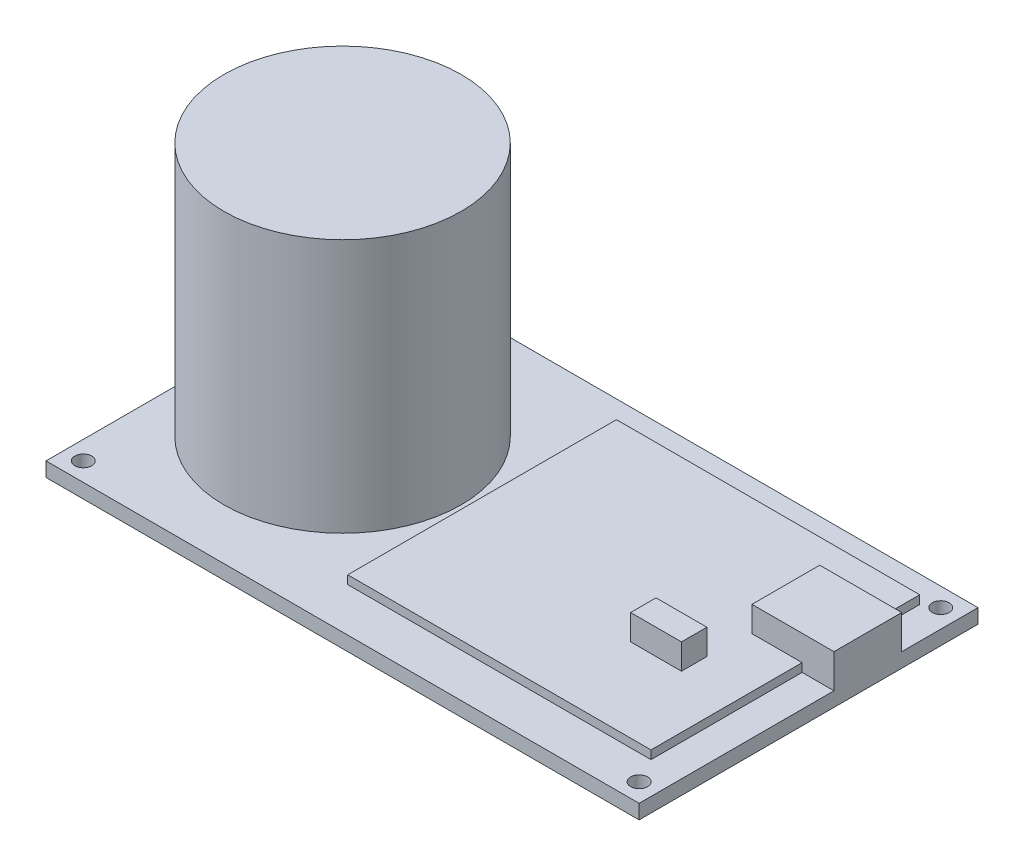
ISO-10303-21;
HEADER;
FILE_DESCRIPTION(('STEP AP214'),'2;1');
FILE_NAME('part.step','',(''),(''),'','','');
FILE_SCHEMA(('AUTOMOTIVE_DESIGN { 1 0 10303 214 1 1 1 1 }'));
ENDSEC;
DATA;
#1=APPLICATION_CONTEXT('core data for automotive mechanical design processes');
#2=APPLICATION_PROTOCOL_DEFINITION('international standard','automotive_design',2000,#1);
#3=PRODUCT_CONTEXT('',#1,'mechanical');
#4=PRODUCT('Part','Part','',(#3));
#5=PRODUCT_RELATED_PRODUCT_CATEGORY('part','',(#4));
#6=PRODUCT_DEFINITION_FORMATION('','',#4);
#7=PRODUCT_DEFINITION_CONTEXT('part definition',#1,'design');
#8=PRODUCT_DEFINITION('design','',#6,#7);
#9=PRODUCT_DEFINITION_SHAPE('','',#8);
#10=(LENGTH_UNIT() NAMED_UNIT(*) SI_UNIT(.MILLI.,.METRE.));
#11=(NAMED_UNIT(*) PLANE_ANGLE_UNIT() SI_UNIT($,.RADIAN.));
#12=(NAMED_UNIT(*) SI_UNIT($,.STERADIAN.) SOLID_ANGLE_UNIT());
#13=UNCERTAINTY_MEASURE_WITH_UNIT(LENGTH_MEASURE(1.E-05),#10,'distance_accuracy_value','');
#14=(GEOMETRIC_REPRESENTATION_CONTEXT(3) GLOBAL_UNCERTAINTY_ASSIGNED_CONTEXT((#13)) GLOBAL_UNIT_ASSIGNED_CONTEXT((#10,
#11,#12)) REPRESENTATION_CONTEXT('',''));
#15=CARTESIAN_POINT('',(0.,0.,0.));
#16=DIRECTION('',(0.,0.,1.));
#17=DIRECTION('',(1.,0.,0.));
#18=AXIS2_PLACEMENT_3D('',#15,#16,#17);
#19=CARTESIAN_POINT('',(0.,1.7,0.));
#20=DIRECTION('',(0.,-1.,0.));
#21=DIRECTION('',(0.,0.,-1.));
#22=AXIS2_PLACEMENT_3D('',#19,#20,#21);
#23=PLANE('',#22);
#24=CARTESIAN_POINT('',(67.8,1.7,-37.8));
#25=DIRECTION('',(0.,1.,0.));
#26=DIRECTION('',(0.,0.,1.));
#27=AXIS2_PLACEMENT_3D('',#24,#25,#26);
#28=CIRCLE('',#27,0.999999999999998);
#29=CARTESIAN_POINT('',(67.8,1.7,-36.8));
#30=VERTEX_POINT('',#29);
#31=EDGE_CURVE('E316',#30,#30,#28,.T.);
#32=ORIENTED_EDGE('',*,*,#31,.F.);
#33=EDGE_LOOP('',(#32));
#34=FACE_BOUND('',#33,.T.);
#35=CARTESIAN_POINT('',(67.8000000000004,1.7,-2.2));
#36=DIRECTION('',(0.,1.,0.));
#37=DIRECTION('',(0.,0.,1.));
#38=AXIS2_PLACEMENT_3D('',#35,#36,#37);
#39=CIRCLE('',#38,0.999999999999998);
#40=CARTESIAN_POINT('',(67.8000000000004,1.7,-1.2));
#41=VERTEX_POINT('',#40);
#42=EDGE_CURVE('E312',#41,#41,#39,.T.);
#43=ORIENTED_EDGE('',*,*,#42,.F.);
#44=EDGE_LOOP('',(#43));
#45=FACE_BOUND('',#44,.T.);
#46=CARTESIAN_POINT('',(2.2000000000004,1.7,-2.19999999999954));
#47=DIRECTION('',(0.,1.,0.));
#48=DIRECTION('',(0.,0.,1.));
#49=AXIS2_PLACEMENT_3D('',#46,#47,#48);
#50=CIRCLE('',#49,0.999999999999998);
#51=CARTESIAN_POINT('',(2.2000000000004,1.7,-1.19999999999954));
#52=VERTEX_POINT('',#51);
#53=EDGE_CURVE('E323',#52,#52,#50,.T.);
#54=ORIENTED_EDGE('',*,*,#53,.F.);
#55=EDGE_LOOP('',(#54));
#56=FACE_BOUND('',#55,.T.);
#57=CARTESIAN_POINT('',(2.20000000000002,1.7,-37.7999999999995));
#58=DIRECTION('',(0.,1.,0.));
#59=DIRECTION('',(0.,0.,1.));
#60=AXIS2_PLACEMENT_3D('',#57,#58,#59);
#61=CIRCLE('',#60,0.999999999999998);
#62=CARTESIAN_POINT('',(2.20000000000002,1.7,-36.7999999999995));
#63=VERTEX_POINT('',#62);
#64=EDGE_CURVE('E317',#63,#63,#61,.T.);
#65=ORIENTED_EDGE('',*,*,#64,.F.);
#66=EDGE_LOOP('',(#65));
#67=FACE_BOUND('',#66,.T.);
#68=CARTESIAN_POINT('',(15.,1.7,-20.));
#69=DIRECTION('',(0.,-1.,0.));
#70=DIRECTION('',(0.,0.,-1.));
#71=AXIS2_PLACEMENT_3D('',#68,#69,#70);
#72=CIRCLE('',#71,14.);
#73=CARTESIAN_POINT('',(15.,1.7,-34.));
#74=VERTEX_POINT('',#73);
#75=EDGE_CURVE('E368',#74,#74,#72,.F.);
#76=ORIENTED_EDGE('',*,*,#75,.F.);
#77=EDGE_LOOP('',(#76));
#78=FACE_BOUND('',#77,.T.);
#79=DIRECTION('',(0.,0.,-1.));
#80=VECTOR('',#79,1.);
#81=CARTESIAN_POINT('',(66.2439566800401,1.7,-5.16164214262371));
#82=LINE('',#81,#80);
#83=CARTESIAN_POINT('',(66.2439566800401,1.7,-5.16164214262371));
#84=VERTEX_POINT('',#83);
#85=CARTESIAN_POINT('',(66.2439566800401,1.7,-23.));
#86=VERTEX_POINT('',#85);
#87=EDGE_CURVE('E51',#84,#86,#82,.T.);
#88=ORIENTED_EDGE('',*,*,#87,.F.);
#89=DIRECTION('',(1.,0.,0.));
#90=VECTOR('',#89,1.);
#91=CARTESIAN_POINT('',(30.4498755707243,1.7,-5.16164214262371));
#92=LINE('',#91,#90);
#93=CARTESIAN_POINT('',(30.4498755707243,1.7,-5.16164214262371));
#94=VERTEX_POINT('',#93);
#95=EDGE_CURVE('E55',#94,#84,#92,.T.);
#96=ORIENTED_EDGE('',*,*,#95,.F.);
#97=DIRECTION('',(0.,0.,1.));
#98=VECTOR('',#97,1.);
#99=CARTESIAN_POINT('',(30.4498755707243,1.7,-5.16164214262371));
#100=LINE('',#99,#98);
#101=CARTESIAN_POINT('',(30.4498755707243,1.7,-36.8793482456979));
#102=VERTEX_POINT('',#101);
#103=EDGE_CURVE('E207',#102,#94,#100,.T.);
#104=ORIENTED_EDGE('',*,*,#103,.F.);
#105=DIRECTION('',(-1.,0.,0.));
#106=VECTOR('',#105,1.);
#107=CARTESIAN_POINT('',(30.4498755707243,1.7,-36.8793482456979));
#108=LINE('',#107,#106);
#109=CARTESIAN_POINT('',(66.2439566800401,1.7,-36.8793482456979));
#110=VERTEX_POINT('',#109);
#111=EDGE_CURVE('E204',#110,#102,#108,.T.);
#112=ORIENTED_EDGE('',*,*,#111,.F.);
#113=CARTESIAN_POINT('',(66.2439566800401,1.7,-31.));
#114=VERTEX_POINT('',#113);
#115=EDGE_CURVE('E459',#114,#110,#82,.T.);
#116=ORIENTED_EDGE('',*,*,#115,.F.);
#117=DIRECTION('',(-1.,0.,0.));
#118=VECTOR('',#117,1.);
#119=CARTESIAN_POINT('',(60.3214945967352,1.7,-31.));
#120=LINE('',#119,#118);
#121=CARTESIAN_POINT('',(70.,1.7,-31.));
#122=VERTEX_POINT('',#121);
#123=EDGE_CURVE('E288',#122,#114,#120,.T.);
#124=ORIENTED_EDGE('',*,*,#123,.F.);
#125=DIRECTION('',(0.,0.,-1.));
#126=VECTOR('',#125,1.);
#127=CARTESIAN_POINT('',(70.,1.7,0.));
#128=LINE('',#127,#126);
#129=CARTESIAN_POINT('',(70.,1.7,-40.));
#130=VERTEX_POINT('',#129);
#131=EDGE_CURVE('E343',#122,#130,#128,.T.);
#132=ORIENTED_EDGE('',*,*,#131,.T.);
#133=DIRECTION('',(-1.,0.,0.));
#134=VECTOR('',#133,1.);
#135=CARTESIAN_POINT('',(0.,1.7,-40.));
#136=LINE('',#135,#134);
#137=CARTESIAN_POINT('',(0.,1.7,-40.));
#138=VERTEX_POINT('',#137);
#139=EDGE_CURVE('E347',#130,#138,#136,.T.);
#140=ORIENTED_EDGE('',*,*,#139,.T.);
#141=DIRECTION('',(0.,0.,1.));
#142=VECTOR('',#141,1.);
#143=CARTESIAN_POINT('',(0.,1.7,0.));
#144=LINE('',#143,#142);
#145=CARTESIAN_POINT('',(0.,1.7,0.));
#146=VERTEX_POINT('',#145);
#147=EDGE_CURVE('E337',#138,#146,#144,.T.);
#148=ORIENTED_EDGE('',*,*,#147,.T.);
#149=DIRECTION('',(1.,0.,0.));
#150=VECTOR('',#149,1.);
#151=CARTESIAN_POINT('',(0.,1.7,0.));
#152=LINE('',#151,#150);
#153=CARTESIAN_POINT('',(70.,1.7,0.));
#154=VERTEX_POINT('',#153);
#155=EDGE_CURVE('E340',#146,#154,#152,.T.);
#156=ORIENTED_EDGE('',*,*,#155,.T.);
#157=CARTESIAN_POINT('',(70.,1.7,-23.));
#158=VERTEX_POINT('',#157);
#159=EDGE_CURVE('E344',#154,#158,#128,.T.);
#160=ORIENTED_EDGE('',*,*,#159,.T.);
#161=DIRECTION('',(1.,0.,0.));
#162=VECTOR('',#161,1.);
#163=CARTESIAN_POINT('',(60.3214945967352,1.7,-23.));
#164=LINE('',#163,#162);
#165=EDGE_CURVE('E283',#86,#158,#164,.T.);
#166=ORIENTED_EDGE('',*,*,#165,.F.);
#167=EDGE_LOOP('',(#88,#96,#104,#112,#116,#124,#132,#140,#148,#156,#160,#166));
#168=FACE_BOUND('',#167,.T.);
#169=ADVANCED_FACE('F36',(#34,#45,#56,#67,#78,#168),#23,.F.);
#170=CARTESIAN_POINT('',(60.3214945967352,5.7,-31.));
#171=DIRECTION('',(1.,0.,0.));
#172=DIRECTION('',(0.,0.,-1.));
#173=AXIS2_PLACEMENT_3D('',#170,#171,#172);
#174=PLANE('',#173);
#175=DIRECTION('',(0.,0.,-1.));
#176=VECTOR('',#175,1.);
#177=CARTESIAN_POINT('',(60.3214945967352,2.7,-31.));
#178=LINE('',#177,#176);
#179=CARTESIAN_POINT('',(60.3214945967352,2.7,-23.));
#180=VERTEX_POINT('',#179);
#181=CARTESIAN_POINT('',(60.3214945967352,2.7,-31.));
#182=VERTEX_POINT('',#181);
#183=EDGE_CURVE('E225',#180,#182,#178,.T.);
#184=ORIENTED_EDGE('',*,*,#183,.F.);
#185=DIRECTION('',(0.,-1.,0.));
#186=VECTOR('',#185,1.);
#187=CARTESIAN_POINT('',(60.3214945967352,5.7,-23.));
#188=LINE('',#187,#186);
#189=CARTESIAN_POINT('',(60.3214945967352,5.7,-23.));
#190=VERTEX_POINT('',#189);
#191=EDGE_CURVE('E306',#190,#180,#188,.T.);
#192=ORIENTED_EDGE('',*,*,#191,.F.);
#193=DIRECTION('',(0.,0.,1.));
#194=VECTOR('',#193,1.);
#195=CARTESIAN_POINT('',(60.3214945967352,5.7,-31.));
#196=LINE('',#195,#194);
#197=CARTESIAN_POINT('',(60.3214945967352,5.7,-31.));
#198=VERTEX_POINT('',#197);
#199=EDGE_CURVE('E284',#198,#190,#196,.T.);
#200=ORIENTED_EDGE('',*,*,#199,.F.);
#201=DIRECTION('',(0.,-1.,0.));
#202=VECTOR('',#201,1.);
#203=CARTESIAN_POINT('',(60.3214945967352,5.7,-31.));
#204=LINE('',#203,#202);
#205=EDGE_CURVE('E294',#198,#182,#204,.T.);
#206=ORIENTED_EDGE('',*,*,#205,.T.);
#207=EDGE_LOOP('',(#184,#192,#200,#206));
#208=FACE_BOUND('',#207,.T.);
#209=ADVANCED_FACE('F399',(#208),#174,.F.);
#210=CARTESIAN_POINT('',(60.3214945967352,5.7,-23.));
#211=DIRECTION('',(0.,0.,-1.));
#212=DIRECTION('',(-1.,0.,0.));
#213=AXIS2_PLACEMENT_3D('',#210,#211,#212);
#214=PLANE('',#213);
#215=DIRECTION('',(0.,1.,0.));
#216=VECTOR('',#215,1.);
#217=CARTESIAN_POINT('',(66.2439566800401,5.7,-23.));
#218=LINE('',#217,#216);
#219=CARTESIAN_POINT('',(66.2439566800401,2.7,-23.));
#220=VERTEX_POINT('',#219);
#221=EDGE_CURVE('E231',#86,#220,#218,.T.);
#222=ORIENTED_EDGE('',*,*,#221,.F.);
#223=ORIENTED_EDGE('',*,*,#165,.T.);
#224=DIRECTION('',(0.,-1.,0.));
#225=VECTOR('',#224,1.);
#226=CARTESIAN_POINT('',(70.,5.7,-23.));
#227=LINE('',#226,#225);
#228=CARTESIAN_POINT('',(70.,5.7,-23.));
#229=VERTEX_POINT('',#228);
#230=EDGE_CURVE('E303',#229,#158,#227,.T.);
#231=ORIENTED_EDGE('',*,*,#230,.F.);
#232=DIRECTION('',(1.,0.,0.));
#233=VECTOR('',#232,1.);
#234=CARTESIAN_POINT('',(60.3214945967352,5.7,-23.));
#235=LINE('',#234,#233);
#236=EDGE_CURVE('E287',#190,#229,#235,.T.);
#237=ORIENTED_EDGE('',*,*,#236,.F.);
#238=ORIENTED_EDGE('',*,*,#191,.T.);
#239=DIRECTION('',(-1.,0.,0.));
#240=VECTOR('',#239,1.);
#241=CARTESIAN_POINT('',(60.3214945967352,2.7,-23.));
#242=LINE('',#241,#240);
#243=EDGE_CURVE('E228',#220,#180,#242,.T.);
#244=ORIENTED_EDGE('',*,*,#243,.F.);
#245=EDGE_LOOP('',(#222,#223,#231,#237,#238,#244));
#246=FACE_BOUND('',#245,.T.);
#247=ADVANCED_FACE('F405',(#246),#214,.F.);
#248=CARTESIAN_POINT('',(60.3214945967352,5.7,-31.));
#249=DIRECTION('',(0.,0.,1.));
#250=DIRECTION('',(1.,0.,0.));
#251=AXIS2_PLACEMENT_3D('',#248,#249,#250);
#252=PLANE('',#251);
#253=DIRECTION('',(0.,-1.,0.));
#254=VECTOR('',#253,1.);
#255=CARTESIAN_POINT('',(66.2439566800401,5.7,-31.));
#256=LINE('',#255,#254);
#257=CARTESIAN_POINT('',(66.2439566800401,2.7,-31.));
#258=VERTEX_POINT('',#257);
#259=EDGE_CURVE('E11',#258,#114,#256,.T.);
#260=ORIENTED_EDGE('',*,*,#259,.F.);
#261=DIRECTION('',(1.,0.,0.));
#262=VECTOR('',#261,1.);
#263=CARTESIAN_POINT('',(60.3214945967352,2.7,-31.));
#264=LINE('',#263,#262);
#265=EDGE_CURVE('E222',#182,#258,#264,.T.);
#266=ORIENTED_EDGE('',*,*,#265,.F.);
#267=ORIENTED_EDGE('',*,*,#205,.F.);
#268=DIRECTION('',(-1.,0.,0.));
#269=VECTOR('',#268,1.);
#270=CARTESIAN_POINT('',(60.3214945967352,5.7,-31.));
#271=LINE('',#270,#269);
#272=CARTESIAN_POINT('',(70.,5.7,-31.));
#273=VERTEX_POINT('',#272);
#274=EDGE_CURVE('E292',#273,#198,#271,.T.);
#275=ORIENTED_EDGE('',*,*,#274,.F.);
#276=DIRECTION('',(0.,-1.,0.));
#277=VECTOR('',#276,1.);
#278=CARTESIAN_POINT('',(70.,5.7,-31.));
#279=LINE('',#278,#277);
#280=EDGE_CURVE('E300',#273,#122,#279,.T.);
#281=ORIENTED_EDGE('',*,*,#280,.T.);
#282=ORIENTED_EDGE('',*,*,#123,.T.);
#283=EDGE_LOOP('',(#260,#266,#267,#275,#281,#282));
#284=FACE_BOUND('',#283,.T.);
#285=ADVANCED_FACE('F417',(#284),#252,.F.);
#286=CARTESIAN_POINT('',(0.,0.,0.));
#287=DIRECTION('',(0.,-1.,0.));
#288=DIRECTION('',(0.,0.,-1.));
#289=AXIS2_PLACEMENT_3D('',#286,#287,#288);
#290=PLANE('',#289);
#291=CARTESIAN_POINT('',(2.20000000000002,0.,-37.7999999999995));
#292=DIRECTION('',(0.,1.,0.));
#293=DIRECTION('',(0.,0.,1.));
#294=AXIS2_PLACEMENT_3D('',#291,#292,#293);
#295=CIRCLE('',#294,0.999999999999998);
#296=CARTESIAN_POINT('',(2.20000000000002,0.,-36.7999999999995));
#297=VERTEX_POINT('',#296);
#298=EDGE_CURVE('E313',#297,#297,#295,.T.);
#299=ORIENTED_EDGE('',*,*,#298,.T.);
#300=EDGE_LOOP('',(#299));
#301=FACE_BOUND('',#300,.T.);
#302=CARTESIAN_POINT('',(2.2000000000004,0.,-2.19999999999954));
#303=DIRECTION('',(0.,1.,0.));
#304=DIRECTION('',(0.,0.,1.));
#305=AXIS2_PLACEMENT_3D('',#302,#303,#304);
#306=CIRCLE('',#305,0.999999999999998);
#307=CARTESIAN_POINT('',(2.2000000000004,0.,-1.19999999999954));
#308=VERTEX_POINT('',#307);
#309=EDGE_CURVE('E320',#308,#308,#306,.T.);
#310=ORIENTED_EDGE('',*,*,#309,.T.);
#311=EDGE_LOOP('',(#310));
#312=FACE_BOUND('',#311,.T.);
#313=CARTESIAN_POINT('',(67.8000000000004,0.,-2.2));
#314=DIRECTION('',(0.,1.,0.));
#315=DIRECTION('',(0.,0.,1.));
#316=AXIS2_PLACEMENT_3D('',#313,#314,#315);
#317=CIRCLE('',#316,0.999999999999998);
#318=CARTESIAN_POINT('',(67.8000000000004,0.,-1.2));
#319=VERTEX_POINT('',#318);
#320=EDGE_CURVE('E326',#319,#319,#317,.T.);
#321=ORIENTED_EDGE('',*,*,#320,.T.);
#322=EDGE_LOOP('',(#321));
#323=FACE_BOUND('',#322,.T.);
#324=CARTESIAN_POINT('',(67.8,0.,-37.8));
#325=DIRECTION('',(0.,1.,0.));
#326=DIRECTION('',(0.,0.,1.));
#327=AXIS2_PLACEMENT_3D('',#324,#325,#326);
#328=CIRCLE('',#327,0.999999999999998);
#329=CARTESIAN_POINT('',(67.8,0.,-36.8));
#330=VERTEX_POINT('',#329);
#331=EDGE_CURVE('E331',#330,#330,#328,.T.);
#332=ORIENTED_EDGE('',*,*,#331,.T.);
#333=EDGE_LOOP('',(#332));
#334=FACE_BOUND('',#333,.T.);
#335=DIRECTION('',(0.,0.,1.));
#336=VECTOR('',#335,1.);
#337=CARTESIAN_POINT('',(0.,0.,0.));
#338=LINE('',#337,#336);
#339=CARTESIAN_POINT('',(0.,0.,-40.));
#340=VERTEX_POINT('',#339);
#341=CARTESIAN_POINT('',(0.,0.,0.));
#342=VERTEX_POINT('',#341);
#343=EDGE_CURVE('E334',#340,#342,#338,.T.);
#344=ORIENTED_EDGE('',*,*,#343,.F.);
#345=DIRECTION('',(-1.,0.,0.));
#346=VECTOR('',#345,1.);
#347=CARTESIAN_POINT('',(0.,0.,-40.));
#348=LINE('',#347,#346);
#349=CARTESIAN_POINT('',(70.,0.,-40.));
#350=VERTEX_POINT('',#349);
#351=EDGE_CURVE('E341',#350,#340,#348,.T.);
#352=ORIENTED_EDGE('',*,*,#351,.F.);
#353=DIRECTION('',(0.,0.,-1.));
#354=VECTOR('',#353,1.);
#355=CARTESIAN_POINT('',(70.,0.,0.));
#356=LINE('',#355,#354);
#357=CARTESIAN_POINT('',(70.,0.,0.));
#358=VERTEX_POINT('',#357);
#359=EDGE_CURVE('E354',#358,#350,#356,.T.);
#360=ORIENTED_EDGE('',*,*,#359,.F.);
#361=DIRECTION('',(1.,0.,0.));
#362=VECTOR('',#361,1.);
#363=CARTESIAN_POINT('',(0.,0.,0.));
#364=LINE('',#363,#362);
#365=EDGE_CURVE('E352',#342,#358,#364,.T.);
#366=ORIENTED_EDGE('',*,*,#365,.F.);
#367=EDGE_LOOP('',(#344,#352,#360,#366));
#368=FACE_BOUND('',#367,.T.);
#369=DIRECTION('',(-1.,0.,0.));
#370=VECTOR('',#369,1.);
#371=CARTESIAN_POINT('',(66.,0.,-4.));
#372=LINE('',#371,#370);
#373=CARTESIAN_POINT('',(66.,0.,-4.));
#374=VERTEX_POINT('',#373);
#375=CARTESIAN_POINT('',(3.99999999999999,0.,-4.00000000000004));
#376=VERTEX_POINT('',#375);
#377=EDGE_CURVE('E248',#374,#376,#372,.T.);
#378=ORIENTED_EDGE('',*,*,#377,.F.);
#379=DIRECTION('',(0.,0.,1.));
#380=VECTOR('',#379,1.);
#381=CARTESIAN_POINT('',(66.,0.,-4.));
#382=LINE('',#381,#380);
#383=CARTESIAN_POINT('',(66.,0.,-36.));
#384=VERTEX_POINT('',#383);
#385=EDGE_CURVE('E234',#384,#374,#382,.T.);
#386=ORIENTED_EDGE('',*,*,#385,.F.);
#387=DIRECTION('',(1.,0.,0.));
#388=VECTOR('',#387,1.);
#389=CARTESIAN_POINT('',(66.,0.,-36.));
#390=LINE('',#389,#388);
#391=CARTESIAN_POINT('',(4.,0.,-36.));
#392=VERTEX_POINT('',#391);
#393=EDGE_CURVE('E239',#392,#384,#390,.T.);
#394=ORIENTED_EDGE('',*,*,#393,.F.);
#395=DIRECTION('',(0.,0.,-1.));
#396=VECTOR('',#395,1.);
#397=CARTESIAN_POINT('',(3.99999999999999,0.,-4.00000000000004));
#398=LINE('',#397,#396);
#399=EDGE_CURVE('E250',#376,#392,#398,.T.);
#400=ORIENTED_EDGE('',*,*,#399,.F.);
#401=EDGE_LOOP('',(#378,#386,#394,#400));
#402=FACE_BOUND('',#401,.T.);
#403=ADVANCED_FACE('F414',(#301,#312,#323,#334,#368,#402),#290,.T.);
#404=CARTESIAN_POINT('',(0.,1.7,0.));
#405=DIRECTION('',(1.,0.,0.));
#406=DIRECTION('',(0.,0.,-1.));
#407=AXIS2_PLACEMENT_3D('',#404,#405,#406);
#408=PLANE('',#407);
#409=ORIENTED_EDGE('',*,*,#343,.T.);
#410=DIRECTION('',(0.,-1.,0.));
#411=VECTOR('',#410,1.);
#412=CARTESIAN_POINT('',(0.,1.7,0.));
#413=LINE('',#412,#411);
#414=EDGE_CURVE('E365',#146,#342,#413,.T.);
#415=ORIENTED_EDGE('',*,*,#414,.F.);
#416=ORIENTED_EDGE('',*,*,#147,.F.);
#417=DIRECTION('',(0.,-1.,0.));
#418=VECTOR('',#417,1.);
#419=CARTESIAN_POINT('',(0.,1.7,-40.));
#420=LINE('',#419,#418);
#421=EDGE_CURVE('E349',#138,#340,#420,.T.);
#422=ORIENTED_EDGE('',*,*,#421,.T.);
#423=EDGE_LOOP('',(#409,#415,#416,#422));
#424=FACE_BOUND('',#423,.T.);
#425=ADVANCED_FACE('F38',(#424),#408,.F.);
#426=CARTESIAN_POINT('',(0.,1.7,0.));
#427=DIRECTION('',(0.,0.,-1.));
#428=DIRECTION('',(-1.,0.,0.));
#429=AXIS2_PLACEMENT_3D('',#426,#427,#428);
#430=PLANE('',#429);
#431=ORIENTED_EDGE('',*,*,#365,.T.);
#432=DIRECTION('',(0.,-1.,0.));
#433=VECTOR('',#432,1.);
#434=CARTESIAN_POINT('',(70.,1.7,0.));
#435=LINE('',#434,#433);
#436=EDGE_CURVE('E362',#154,#358,#435,.T.);
#437=ORIENTED_EDGE('',*,*,#436,.F.);
#438=ORIENTED_EDGE('',*,*,#155,.F.);
#439=ORIENTED_EDGE('',*,*,#414,.T.);
#440=EDGE_LOOP('',(#431,#437,#438,#439));
#441=FACE_BOUND('',#440,.T.);
#442=ADVANCED_FACE('F425',(#441),#430,.F.);
#443=CARTESIAN_POINT('',(70.,1.7,0.));
#444=DIRECTION('',(-1.,0.,0.));
#445=DIRECTION('',(0.,0.,1.));
#446=AXIS2_PLACEMENT_3D('',#443,#444,#445);
#447=PLANE('',#446);
#448=ORIENTED_EDGE('',*,*,#359,.T.);
#449=DIRECTION('',(0.,-1.,0.));
#450=VECTOR('',#449,1.);
#451=CARTESIAN_POINT('',(70.,1.7,-40.));
#452=LINE('',#451,#450);
#453=EDGE_CURVE('E359',#130,#350,#452,.T.);
#454=ORIENTED_EDGE('',*,*,#453,.F.);
#455=ORIENTED_EDGE('',*,*,#131,.F.);
#456=ORIENTED_EDGE('',*,*,#280,.F.);
#457=DIRECTION('',(0.,0.,-1.));
#458=VECTOR('',#457,1.);
#459=CARTESIAN_POINT('',(70.,5.7,-31.));
#460=LINE('',#459,#458);
#461=EDGE_CURVE('E290',#229,#273,#460,.T.);
#462=ORIENTED_EDGE('',*,*,#461,.F.);
#463=ORIENTED_EDGE('',*,*,#230,.T.);
#464=ORIENTED_EDGE('',*,*,#159,.F.);
#465=ORIENTED_EDGE('',*,*,#436,.T.);
#466=EDGE_LOOP('',(#448,#454,#455,#456,#462,#463,#464,#465));
#467=FACE_BOUND('',#466,.T.);
#468=ADVANCED_FACE('F422',(#467),#447,.F.);
#469=CARTESIAN_POINT('',(0.,1.7,-40.));
#470=DIRECTION('',(0.,0.,1.));
#471=DIRECTION('',(1.,0.,0.));
#472=AXIS2_PLACEMENT_3D('',#469,#470,#471);
#473=PLANE('',#472);
#474=ORIENTED_EDGE('',*,*,#351,.T.);
#475=ORIENTED_EDGE('',*,*,#421,.F.);
#476=ORIENTED_EDGE('',*,*,#139,.F.);
#477=ORIENTED_EDGE('',*,*,#453,.T.);
#478=EDGE_LOOP('',(#474,#475,#476,#477));
#479=FACE_BOUND('',#478,.T.);
#480=ADVANCED_FACE('F419',(#479),#473,.F.);
#481=CARTESIAN_POINT('',(67.8,0.,-37.8));
#482=DIRECTION('',(0.,1.,0.));
#483=DIRECTION('',(0.,0.,1.));
#484=AXIS2_PLACEMENT_3D('',#481,#482,#483);
#485=CYLINDRICAL_SURFACE('',#484,0.999999999999998);
#486=ORIENTED_EDGE('',*,*,#331,.F.);
#487=EDGE_LOOP('',(#486));
#488=FACE_BOUND('',#487,.T.);
#489=ORIENTED_EDGE('',*,*,#31,.T.);
#490=EDGE_LOOP('',(#489));
#491=FACE_BOUND('',#490,.T.);
#492=ADVANCED_FACE('F412',(#488,#491),#485,.F.);
#493=CARTESIAN_POINT('',(67.8000000000004,0.,-2.2));
#494=DIRECTION('',(0.,1.,0.));
#495=DIRECTION('',(0.,0.,1.));
#496=AXIS2_PLACEMENT_3D('',#493,#494,#495);
#497=CYLINDRICAL_SURFACE('',#496,0.999999999999998);
#498=ORIENTED_EDGE('',*,*,#320,.F.);
#499=EDGE_LOOP('',(#498));
#500=FACE_BOUND('',#499,.T.);
#501=ORIENTED_EDGE('',*,*,#42,.T.);
#502=EDGE_LOOP('',(#501));
#503=FACE_BOUND('',#502,.T.);
#504=ADVANCED_FACE('F651',(#500,#503),#497,.F.);
#505=CARTESIAN_POINT('',(2.2000000000004,0.,-2.19999999999954));
#506=DIRECTION('',(0.,1.,0.));
#507=DIRECTION('',(0.,0.,1.));
#508=AXIS2_PLACEMENT_3D('',#505,#506,#507);
#509=CYLINDRICAL_SURFACE('',#508,0.999999999999998);
#510=ORIENTED_EDGE('',*,*,#309,.F.);
#511=EDGE_LOOP('',(#510));
#512=FACE_BOUND('',#511,.T.);
#513=ORIENTED_EDGE('',*,*,#53,.T.);
#514=EDGE_LOOP('',(#513));
#515=FACE_BOUND('',#514,.T.);
#516=ADVANCED_FACE('F643',(#512,#515),#509,.F.);
#517=CARTESIAN_POINT('',(2.20000000000002,0.,-37.7999999999995));
#518=DIRECTION('',(0.,1.,0.));
#519=DIRECTION('',(0.,0.,1.));
#520=AXIS2_PLACEMENT_3D('',#517,#518,#519);
#521=CYLINDRICAL_SURFACE('',#520,0.999999999999998);
#522=ORIENTED_EDGE('',*,*,#298,.F.);
#523=EDGE_LOOP('',(#522));
#524=FACE_BOUND('',#523,.T.);
#525=ORIENTED_EDGE('',*,*,#64,.T.);
#526=EDGE_LOOP('',(#525));
#527=FACE_BOUND('',#526,.T.);
#528=ADVANCED_FACE('F635',(#524,#527),#521,.F.);
#529=CARTESIAN_POINT('',(15.,31.7,-20.));
#530=DIRECTION('',(0.,-1.,0.));
#531=DIRECTION('',(0.,0.,-1.));
#532=AXIS2_PLACEMENT_3D('',#529,#530,#531);
#533=CYLINDRICAL_SURFACE('',#532,14.);
#534=CARTESIAN_POINT('',(15.,31.7,-20.));
#535=DIRECTION('',(0.,1.,0.));
#536=DIRECTION('',(0.,0.,1.));
#537=AXIS2_PLACEMENT_3D('',#534,#535,#536);
#538=CIRCLE('',#537,14.);
#539=CARTESIAN_POINT('',(15.,31.7,-6.));
#540=VERTEX_POINT('',#539);
#541=EDGE_CURVE('E309',#540,#540,#538,.T.);
#542=ORIENTED_EDGE('',*,*,#541,.F.);
#543=EDGE_LOOP('',(#542));
#544=FACE_BOUND('',#543,.T.);
#545=ORIENTED_EDGE('',*,*,#75,.T.);
#546=EDGE_LOOP('',(#545));
#547=FACE_BOUND('',#546,.T.);
#548=ADVANCED_FACE('F627',(#544,#547),#533,.T.);
#549=CARTESIAN_POINT('',(0.,31.7,0.));
#550=DIRECTION('',(0.,1.,0.));
#551=DIRECTION('',(0.,0.,1.));
#552=AXIS2_PLACEMENT_3D('',#549,#550,#551);
#553=PLANE('',#552);
#554=ORIENTED_EDGE('',*,*,#541,.T.);
#555=EDGE_LOOP('',(#554));
#556=FACE_BOUND('',#555,.T.);
#557=ADVANCED_FACE('F619',(#556),#553,.T.);
#558=CARTESIAN_POINT('',(0.,5.7,0.));
#559=DIRECTION('',(0.,1.,0.));
#560=DIRECTION('',(0.,0.,1.));
#561=AXIS2_PLACEMENT_3D('',#558,#559,#560);
#562=PLANE('',#561);
#563=ORIENTED_EDGE('',*,*,#199,.T.);
#564=ORIENTED_EDGE('',*,*,#236,.T.);
#565=ORIENTED_EDGE('',*,*,#461,.T.);
#566=ORIENTED_EDGE('',*,*,#274,.T.);
#567=EDGE_LOOP('',(#563,#564,#565,#566));
#568=FACE_BOUND('',#567,.T.);
#569=ADVANCED_FACE('F453',(#568),#562,.T.);
#570=CARTESIAN_POINT('',(66.,-1.,-4.));
#571=DIRECTION('',(-1.,0.,0.));
#572=DIRECTION('',(0.,0.,1.));
#573=AXIS2_PLACEMENT_3D('',#570,#571,#572);
#574=PLANE('',#573);
#575=ORIENTED_EDGE('',*,*,#385,.T.);
#576=DIRECTION('',(0.,1.,0.));
#577=VECTOR('',#576,1.);
#578=CARTESIAN_POINT('',(66.,-1.,-4.));
#579=LINE('',#578,#577);
#580=CARTESIAN_POINT('',(66.,-1.,-4.));
#581=VERTEX_POINT('',#580);
#582=EDGE_CURVE('E261',#581,#374,#579,.T.);
#583=ORIENTED_EDGE('',*,*,#582,.F.);
#584=DIRECTION('',(0.,0.,1.));
#585=VECTOR('',#584,1.);
#586=CARTESIAN_POINT('',(66.,-1.,-4.));
#587=LINE('',#586,#585);
#588=CARTESIAN_POINT('',(66.,-1.,-36.));
#589=VERTEX_POINT('',#588);
#590=EDGE_CURVE('E235',#589,#581,#587,.T.);
#591=ORIENTED_EDGE('',*,*,#590,.F.);
#592=DIRECTION('',(0.,1.,0.));
#593=VECTOR('',#592,1.);
#594=CARTESIAN_POINT('',(66.,-1.,-36.));
#595=LINE('',#594,#593);
#596=EDGE_CURVE('E245',#589,#384,#595,.T.);
#597=ORIENTED_EDGE('',*,*,#596,.T.);
#598=EDGE_LOOP('',(#575,#583,#591,#597));
#599=FACE_BOUND('',#598,.T.);
#600=ADVANCED_FACE('F506',(#599),#574,.F.);
#601=CARTESIAN_POINT('',(66.,-1.,-4.));
#602=DIRECTION('',(0.,0.,-1.));
#603=DIRECTION('',(-1.,0.,0.));
#604=AXIS2_PLACEMENT_3D('',#601,#602,#603);
#605=PLANE('',#604);
#606=ORIENTED_EDGE('',*,*,#377,.T.);
#607=DIRECTION('',(0.,1.,0.));
#608=VECTOR('',#607,1.);
#609=CARTESIAN_POINT('',(3.99999999999999,-1.,-4.00000000000004));
#610=LINE('',#609,#608);
#611=CARTESIAN_POINT('',(3.99999999999999,-1.,-4.00000000000004));
#612=VERTEX_POINT('',#611);
#613=EDGE_CURVE('E258',#612,#376,#610,.T.);
#614=ORIENTED_EDGE('',*,*,#613,.F.);
#615=DIRECTION('',(-1.,0.,0.));
#616=VECTOR('',#615,1.);
#617=CARTESIAN_POINT('',(66.,-1.,-4.));
#618=LINE('',#617,#616);
#619=EDGE_CURVE('E238',#581,#612,#618,.T.);
#620=ORIENTED_EDGE('',*,*,#619,.F.);
#621=ORIENTED_EDGE('',*,*,#582,.T.);
#622=EDGE_LOOP('',(#606,#614,#620,#621));
#623=FACE_BOUND('',#622,.T.);
#624=ADVANCED_FACE('F502',(#623),#605,.F.);
#625=CARTESIAN_POINT('',(3.99999999999999,-1.,-4.00000000000004));
#626=DIRECTION('',(1.,0.,0.));
#627=DIRECTION('',(0.,0.,-1.));
#628=AXIS2_PLACEMENT_3D('',#625,#626,#627);
#629=PLANE('',#628);
#630=ORIENTED_EDGE('',*,*,#399,.T.);
#631=DIRECTION('',(0.,1.,0.));
#632=VECTOR('',#631,1.);
#633=CARTESIAN_POINT('',(4.,-1.,-36.));
#634=LINE('',#633,#632);
#635=CARTESIAN_POINT('',(4.,-1.,-36.));
#636=VERTEX_POINT('',#635);
#637=EDGE_CURVE('E256',#636,#392,#634,.T.);
#638=ORIENTED_EDGE('',*,*,#637,.F.);
#639=DIRECTION('',(0.,0.,-1.));
#640=VECTOR('',#639,1.);
#641=CARTESIAN_POINT('',(3.99999999999999,-1.,-4.00000000000004));
#642=LINE('',#641,#640);
#643=EDGE_CURVE('E241',#612,#636,#642,.T.);
#644=ORIENTED_EDGE('',*,*,#643,.F.);
#645=ORIENTED_EDGE('',*,*,#613,.T.);
#646=EDGE_LOOP('',(#630,#638,#644,#645));
#647=FACE_BOUND('',#646,.T.);
#648=ADVANCED_FACE('F498',(#647),#629,.F.);
#649=CARTESIAN_POINT('',(66.,-1.,-36.));
#650=DIRECTION('',(0.,0.,1.));
#651=DIRECTION('',(1.,0.,0.));
#652=AXIS2_PLACEMENT_3D('',#649,#650,#651);
#653=PLANE('',#652);
#654=ORIENTED_EDGE('',*,*,#393,.T.);
#655=ORIENTED_EDGE('',*,*,#596,.F.);
#656=DIRECTION('',(1.,0.,0.));
#657=VECTOR('',#656,1.);
#658=CARTESIAN_POINT('',(66.,-1.,-36.));
#659=LINE('',#658,#657);
#660=EDGE_CURVE('E243',#636,#589,#659,.T.);
#661=ORIENTED_EDGE('',*,*,#660,.F.);
#662=ORIENTED_EDGE('',*,*,#637,.T.);
#663=EDGE_LOOP('',(#654,#655,#661,#662));
#664=FACE_BOUND('',#663,.T.);
#665=ADVANCED_FACE('F494',(#664),#653,.F.);
#666=CARTESIAN_POINT('',(0.,-1.,0.));
#667=DIRECTION('',(0.,1.,0.));
#668=DIRECTION('',(0.,0.,1.));
#669=AXIS2_PLACEMENT_3D('',#666,#667,#668);
#670=PLANE('',#669);
#671=ORIENTED_EDGE('',*,*,#590,.T.);
#672=ORIENTED_EDGE('',*,*,#619,.T.);
#673=ORIENTED_EDGE('',*,*,#643,.T.);
#674=ORIENTED_EDGE('',*,*,#660,.T.);
#675=EDGE_LOOP('',(#671,#672,#673,#674));
#676=FACE_BOUND('',#675,.T.);
#677=ADVANCED_FACE('F485',(#676),#670,.F.);
#678=CARTESIAN_POINT('',(66.2439566800401,2.7,-5.16164214262371));
#679=DIRECTION('',(-1.,0.,0.));
#680=DIRECTION('',(0.,0.,1.));
#681=AXIS2_PLACEMENT_3D('',#678,#679,#680);
#682=PLANE('',#681);
#683=ORIENTED_EDGE('',*,*,#87,.T.);
#684=ORIENTED_EDGE('',*,*,#221,.T.);
#685=DIRECTION('',(0.,0.,-1.));
#686=VECTOR('',#685,1.);
#687=CARTESIAN_POINT('',(66.2439566800401,2.7,-5.16164214262371));
#688=LINE('',#687,#686);
#689=CARTESIAN_POINT('',(66.2439566800401,2.7,-5.16164214262371));
#690=VERTEX_POINT('',#689);
#691=EDGE_CURVE('E477',#690,#220,#688,.T.);
#692=ORIENTED_EDGE('',*,*,#691,.F.);
#693=DIRECTION('',(0.,-1.,0.));
#694=VECTOR('',#693,1.);
#695=CARTESIAN_POINT('',(66.2439566800401,2.7,-5.16164214262371));
#696=LINE('',#695,#694);
#697=EDGE_CURVE('E190',#690,#84,#696,.T.);
#698=ORIENTED_EDGE('',*,*,#697,.T.);
#699=EDGE_LOOP('',(#683,#684,#692,#698));
#700=FACE_BOUND('',#699,.T.);
#701=ADVANCED_FACE('F458',(#700),#682,.F.);
#702=CARTESIAN_POINT('',(66.2439566800401,2.7,-36.8793482456979));
#703=VERTEX_POINT('',#702);
#704=EDGE_CURVE('E194',#258,#703,#688,.T.);
#705=ORIENTED_EDGE('',*,*,#704,.F.);
#706=ORIENTED_EDGE('',*,*,#259,.T.);
#707=ORIENTED_EDGE('',*,*,#115,.T.);
#708=DIRECTION('',(0.,-1.,0.));
#709=VECTOR('',#708,1.);
#710=CARTESIAN_POINT('',(66.2439566800401,2.7,-36.8793482456979));
#711=LINE('',#710,#709);
#712=EDGE_CURVE('E213',#703,#110,#711,.T.);
#713=ORIENTED_EDGE('',*,*,#712,.F.);
#714=EDGE_LOOP('',(#705,#706,#707,#713));
#715=FACE_BOUND('',#714,.T.);
#716=ADVANCED_FACE('F474',(#715),#682,.F.);
#717=CARTESIAN_POINT('',(0.,2.7,0.));
#718=DIRECTION('',(0.,-1.,0.));
#719=DIRECTION('',(0.,0.,-1.));
#720=AXIS2_PLACEMENT_3D('',#717,#718,#719);
#721=PLANE('',#720);
#722=DIRECTION('',(-1.,0.,0.));
#723=VECTOR('',#722,1.);
#724=CARTESIAN_POINT('',(54.,2.7,-15.));
#725=LINE('',#724,#723);
#726=CARTESIAN_POINT('',(60.,2.7,-15.));
#727=VERTEX_POINT('',#726);
#728=CARTESIAN_POINT('',(54.,2.7,-15.));
#729=VERTEX_POINT('',#728);
#730=EDGE_CURVE('E211',#727,#729,#725,.T.);
#731=ORIENTED_EDGE('',*,*,#730,.T.);
#732=DIRECTION('',(0.,0.,-1.));
#733=VECTOR('',#732,1.);
#734=CARTESIAN_POINT('',(54.,2.7,-15.));
#735=LINE('',#734,#733);
#736=CARTESIAN_POINT('',(54.,2.7,-18.));
#737=VERTEX_POINT('',#736);
#738=EDGE_CURVE('E219',#729,#737,#735,.T.);
#739=ORIENTED_EDGE('',*,*,#738,.T.);
#740=DIRECTION('',(1.,0.,0.));
#741=VECTOR('',#740,1.);
#742=CARTESIAN_POINT('',(54.,2.7,-18.));
#743=LINE('',#742,#741);
#744=CARTESIAN_POINT('',(60.,2.7,-18.));
#745=VERTEX_POINT('',#744);
#746=EDGE_CURVE('E44',#737,#745,#743,.T.);
#747=ORIENTED_EDGE('',*,*,#746,.T.);
#748=DIRECTION('',(0.,0.,1.));
#749=VECTOR('',#748,1.);
#750=CARTESIAN_POINT('',(60.,2.7,-15.));
#751=LINE('',#750,#749);
#752=EDGE_CURVE('E208',#745,#727,#751,.T.);
#753=ORIENTED_EDGE('',*,*,#752,.T.);
#754=EDGE_LOOP('',(#731,#739,#747,#753));
#755=FACE_BOUND('',#754,.T.);
#756=ORIENTED_EDGE('',*,*,#691,.T.);
#757=ORIENTED_EDGE('',*,*,#243,.T.);
#758=ORIENTED_EDGE('',*,*,#183,.T.);
#759=ORIENTED_EDGE('',*,*,#265,.T.);
#760=ORIENTED_EDGE('',*,*,#704,.T.);
#761=DIRECTION('',(-1.,0.,0.));
#762=VECTOR('',#761,1.);
#763=CARTESIAN_POINT('',(30.4498755707243,2.7,-36.8793482456979));
#764=LINE('',#763,#762);
#765=CARTESIAN_POINT('',(30.4498755707243,2.7,-36.8793482456979));
#766=VERTEX_POINT('',#765);
#767=EDGE_CURVE('E200',#703,#766,#764,.T.);
#768=ORIENTED_EDGE('',*,*,#767,.T.);
#769=DIRECTION('',(0.,0.,1.));
#770=VECTOR('',#769,1.);
#771=CARTESIAN_POINT('',(30.4498755707243,2.7,-5.16164214262371));
#772=LINE('',#771,#770);
#773=CARTESIAN_POINT('',(30.4498755707243,2.7,-5.16164214262371));
#774=VERTEX_POINT('',#773);
#775=EDGE_CURVE('E195',#766,#774,#772,.T.);
#776=ORIENTED_EDGE('',*,*,#775,.T.);
#777=DIRECTION('',(1.,0.,0.));
#778=VECTOR('',#777,1.);
#779=CARTESIAN_POINT('',(30.4498755707243,2.7,-5.16164214262371));
#780=LINE('',#779,#778);
#781=EDGE_CURVE('E183',#774,#690,#780,.T.);
#782=ORIENTED_EDGE('',*,*,#781,.T.);
#783=EDGE_LOOP('',(#756,#757,#758,#759,#760,#768,#776,#782));
#784=FACE_BOUND('',#783,.T.);
#785=ADVANCED_FACE('F198',(#755,#784),#721,.F.);
#786=CARTESIAN_POINT('',(30.4498755707243,2.7,-5.16164214262371));
#787=DIRECTION('',(1.,0.,0.));
#788=DIRECTION('',(0.,0.,-1.));
#789=AXIS2_PLACEMENT_3D('',#786,#787,#788);
#790=PLANE('',#789);
#791=ORIENTED_EDGE('',*,*,#103,.T.);
#792=DIRECTION('',(0.,-1.,0.));
#793=VECTOR('',#792,1.);
#794=CARTESIAN_POINT('',(30.4498755707243,2.7,-5.16164214262371));
#795=LINE('',#794,#793);
#796=EDGE_CURVE('E187',#774,#94,#795,.T.);
#797=ORIENTED_EDGE('',*,*,#796,.F.);
#798=ORIENTED_EDGE('',*,*,#775,.F.);
#799=DIRECTION('',(0.,-1.,0.));
#800=VECTOR('',#799,1.);
#801=CARTESIAN_POINT('',(30.4498755707243,2.7,-36.8793482456979));
#802=LINE('',#801,#800);
#803=EDGE_CURVE('E467',#766,#102,#802,.T.);
#804=ORIENTED_EDGE('',*,*,#803,.T.);
#805=EDGE_LOOP('',(#791,#797,#798,#804));
#806=FACE_BOUND('',#805,.T.);
#807=ADVANCED_FACE('F206',(#806),#790,.F.);
#808=CARTESIAN_POINT('',(30.4498755707243,2.7,-5.16164214262371));
#809=DIRECTION('',(0.,0.,-1.));
#810=DIRECTION('',(-1.,0.,0.));
#811=AXIS2_PLACEMENT_3D('',#808,#809,#810);
#812=PLANE('',#811);
#813=ORIENTED_EDGE('',*,*,#95,.T.);
#814=ORIENTED_EDGE('',*,*,#697,.F.);
#815=ORIENTED_EDGE('',*,*,#781,.F.);
#816=ORIENTED_EDGE('',*,*,#796,.T.);
#817=EDGE_LOOP('',(#813,#814,#815,#816));
#818=FACE_BOUND('',#817,.T.);
#819=ADVANCED_FACE('F185',(#818),#812,.F.);
#820=CARTESIAN_POINT('',(30.4498755707243,2.7,-36.8793482456979));
#821=DIRECTION('',(0.,0.,1.));
#822=DIRECTION('',(1.,0.,0.));
#823=AXIS2_PLACEMENT_3D('',#820,#821,#822);
#824=PLANE('',#823);
#825=ORIENTED_EDGE('',*,*,#111,.T.);
#826=ORIENTED_EDGE('',*,*,#803,.F.);
#827=ORIENTED_EDGE('',*,*,#767,.F.);
#828=ORIENTED_EDGE('',*,*,#712,.T.);
#829=EDGE_LOOP('',(#825,#826,#827,#828));
#830=FACE_BOUND('',#829,.T.);
#831=ADVANCED_FACE('F471',(#830),#824,.F.);
#832=CARTESIAN_POINT('',(0.,5.7,0.));
#833=DIRECTION('',(0.,-1.,0.));
#834=DIRECTION('',(0.,0.,-1.));
#835=AXIS2_PLACEMENT_3D('',#832,#833,#834);
#836=PLANE('',#835);
#837=DIRECTION('',(0.,0.,1.));
#838=VECTOR('',#837,1.);
#839=CARTESIAN_POINT('',(54.,5.7,-15.));
#840=LINE('',#839,#838);
#841=CARTESIAN_POINT('',(54.,5.7,-18.));
#842=VERTEX_POINT('',#841);
#843=CARTESIAN_POINT('',(54.,5.7,-15.));
#844=VERTEX_POINT('',#843);
#845=EDGE_CURVE('E263',#842,#844,#840,.T.);
#846=ORIENTED_EDGE('',*,*,#845,.T.);
#847=DIRECTION('',(1.,0.,0.));
#848=VECTOR('',#847,1.);
#849=CARTESIAN_POINT('',(54.,5.7,-15.));
#850=LINE('',#849,#848);
#851=CARTESIAN_POINT('',(60.,5.7,-15.));
#852=VERTEX_POINT('',#851);
#853=EDGE_CURVE('E266',#844,#852,#850,.T.);
#854=ORIENTED_EDGE('',*,*,#853,.T.);
#855=DIRECTION('',(0.,0.,-1.));
#856=VECTOR('',#855,1.);
#857=CARTESIAN_POINT('',(60.,5.7,-15.));
#858=LINE('',#857,#856);
#859=CARTESIAN_POINT('',(60.,5.7,-18.));
#860=VERTEX_POINT('',#859);
#861=EDGE_CURVE('E268',#852,#860,#858,.T.);
#862=ORIENTED_EDGE('',*,*,#861,.T.);
#863=DIRECTION('',(-1.,0.,0.));
#864=VECTOR('',#863,1.);
#865=CARTESIAN_POINT('',(54.,5.7,-18.));
#866=LINE('',#865,#864);
#867=EDGE_CURVE('E270',#860,#842,#866,.T.);
#868=ORIENTED_EDGE('',*,*,#867,.T.);
#869=EDGE_LOOP('',(#846,#854,#862,#868));
#870=FACE_BOUND('',#869,.T.);
#871=ADVANCED_FACE('F383',(#870),#836,.F.);
#872=CARTESIAN_POINT('',(54.,5.7,-18.));
#873=DIRECTION('',(0.,0.,1.));
#874=DIRECTION('',(1.,0.,0.));
#875=AXIS2_PLACEMENT_3D('',#872,#873,#874);
#876=PLANE('',#875);
#877=ORIENTED_EDGE('',*,*,#746,.F.);
#878=DIRECTION('',(0.,-1.,0.));
#879=VECTOR('',#878,1.);
#880=CARTESIAN_POINT('',(54.,5.7,-18.));
#881=LINE('',#880,#879);
#882=EDGE_CURVE('E272',#842,#737,#881,.T.);
#883=ORIENTED_EDGE('',*,*,#882,.F.);
#884=ORIENTED_EDGE('',*,*,#867,.F.);
#885=DIRECTION('',(0.,-1.,0.));
#886=VECTOR('',#885,1.);
#887=CARTESIAN_POINT('',(60.,5.7,-18.));
#888=LINE('',#887,#886);
#889=EDGE_CURVE('E275',#860,#745,#888,.T.);
#890=ORIENTED_EDGE('',*,*,#889,.T.);
#891=EDGE_LOOP('',(#877,#883,#884,#890));
#892=FACE_BOUND('',#891,.T.);
#893=ADVANCED_FACE('F375',(#892),#876,.F.);
#894=CARTESIAN_POINT('',(60.,5.7,-15.));
#895=DIRECTION('',(-1.,0.,0.));
#896=DIRECTION('',(0.,0.,1.));
#897=AXIS2_PLACEMENT_3D('',#894,#895,#896);
#898=PLANE('',#897);
#899=ORIENTED_EDGE('',*,*,#752,.F.);
#900=ORIENTED_EDGE('',*,*,#889,.F.);
#901=ORIENTED_EDGE('',*,*,#861,.F.);
#902=DIRECTION('',(0.,-1.,0.));
#903=VECTOR('',#902,1.);
#904=CARTESIAN_POINT('',(60.,5.7,-15.));
#905=LINE('',#904,#903);
#906=EDGE_CURVE('E277',#852,#727,#905,.T.);
#907=ORIENTED_EDGE('',*,*,#906,.T.);
#908=EDGE_LOOP('',(#899,#900,#901,#907));
#909=FACE_BOUND('',#908,.T.);
#910=ADVANCED_FACE('F387',(#909),#898,.F.);
#911=CARTESIAN_POINT('',(54.,5.7,-15.));
#912=DIRECTION('',(0.,0.,-1.));
#913=DIRECTION('',(-1.,0.,0.));
#914=AXIS2_PLACEMENT_3D('',#911,#912,#913);
#915=PLANE('',#914);
#916=ORIENTED_EDGE('',*,*,#730,.F.);
#917=ORIENTED_EDGE('',*,*,#906,.F.);
#918=ORIENTED_EDGE('',*,*,#853,.F.);
#919=DIRECTION('',(0.,-1.,0.));
#920=VECTOR('',#919,1.);
#921=CARTESIAN_POINT('',(54.,5.7,-15.));
#922=LINE('',#921,#920);
#923=EDGE_CURVE('E280',#844,#729,#922,.T.);
#924=ORIENTED_EDGE('',*,*,#923,.T.);
#925=EDGE_LOOP('',(#916,#917,#918,#924));
#926=FACE_BOUND('',#925,.T.);
#927=ADVANCED_FACE('F389',(#926),#915,.F.);
#928=CARTESIAN_POINT('',(54.,5.7,-15.));
#929=DIRECTION('',(1.,0.,0.));
#930=DIRECTION('',(0.,0.,-1.));
#931=AXIS2_PLACEMENT_3D('',#928,#929,#930);
#932=PLANE('',#931);
#933=ORIENTED_EDGE('',*,*,#738,.F.);
#934=ORIENTED_EDGE('',*,*,#923,.F.);
#935=ORIENTED_EDGE('',*,*,#845,.F.);
#936=ORIENTED_EDGE('',*,*,#882,.T.);
#937=EDGE_LOOP('',(#933,#934,#935,#936));
#938=FACE_BOUND('',#937,.T.);
#939=ADVANCED_FACE('F380',(#938),#932,.F.);
#940=CLOSED_SHELL('',(#169,#209,#247,#285,#403,#425,#442,#468,#480,#492,#504,#516,#528,#548,
#557,#569,#600,#624,#648,#665,#677,#701,#716,#785,#807,#819,#831,#871,#893,#910,#927,#939));
#941=MANIFOLD_SOLID_BREP('B2',#940);
#942=ADVANCED_BREP_SHAPE_REPRESENTATION('',(#18,#941),#14);
#943=SHAPE_DEFINITION_REPRESENTATION(#9,#942);
ENDSEC;
END-ISO-10303-21;
